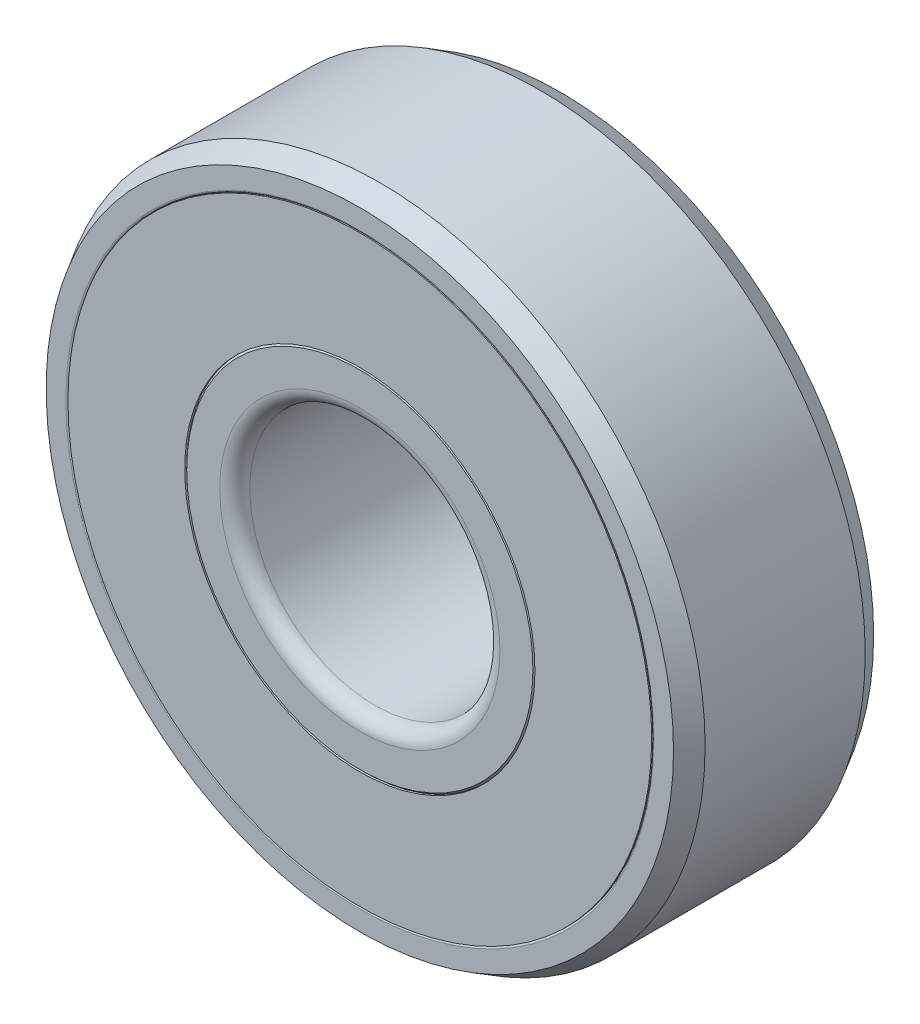
ISO-10303-21;
HEADER;
FILE_DESCRIPTION(('STEP AP214'),'2;1');
FILE_NAME('part.step','',(''),(''),'','','');
FILE_SCHEMA(('AUTOMOTIVE_DESIGN { 1 0 10303 214 1 1 1 1 }'));
ENDSEC;
DATA;
#1=APPLICATION_CONTEXT('core data for automotive mechanical design processes');
#2=APPLICATION_PROTOCOL_DEFINITION('international standard','automotive_design',2000,#1);
#3=PRODUCT_CONTEXT('',#1,'mechanical');
#4=PRODUCT('Part','Part','',(#3));
#5=PRODUCT_RELATED_PRODUCT_CATEGORY('part','',(#4));
#6=PRODUCT_DEFINITION_FORMATION('','',#4);
#7=PRODUCT_DEFINITION_CONTEXT('part definition',#1,'design');
#8=PRODUCT_DEFINITION('design','',#6,#7);
#9=PRODUCT_DEFINITION_SHAPE('','',#8);
#10=(LENGTH_UNIT() NAMED_UNIT(*) SI_UNIT(.MILLI.,.METRE.));
#11=(NAMED_UNIT(*) PLANE_ANGLE_UNIT() SI_UNIT($,.RADIAN.));
#12=(NAMED_UNIT(*) SI_UNIT($,.STERADIAN.) SOLID_ANGLE_UNIT());
#13=UNCERTAINTY_MEASURE_WITH_UNIT(LENGTH_MEASURE(1.E-05),#10,'distance_accuracy_value','');
#14=(GEOMETRIC_REPRESENTATION_CONTEXT(3) GLOBAL_UNCERTAINTY_ASSIGNED_CONTEXT((#13)) GLOBAL_UNIT_ASSIGNED_CONTEXT((#10,
#11,#12)) REPRESENTATION_CONTEXT('',''));
#15=CARTESIAN_POINT('',(0.,0.,0.));
#16=DIRECTION('',(0.,0.,1.));
#17=DIRECTION('',(1.,0.,0.));
#18=AXIS2_PLACEMENT_3D('',#15,#16,#17);
#19=CARTESIAN_POINT('',(3.6485469181841,-2.9096190753408,0.));
#20=DIRECTION('',(-0.781831482468022,0.623489801858743,0.));
#21=DIRECTION('',(0.,0.,-1.));
#22=AXIS2_PLACEMENT_3D('',#19,#20,#21);
#23=SPHERICAL_SURFACE('',#22,1.61111111111111);
#24=CARTESIAN_POINT('',(2.3889295297634,-1.90510772790171,0.));
#25=VERTEX_POINT('',#24);
#26=VERTEX_LOOP('',#25);
#27=FACE_BOUND('',#26,.T.);
#28=ADVANCED_FACE('F45',(#27),#23,.T.);
#29=CLOSED_SHELL('',(#28));
#30=MANIFOLD_SOLID_BREP('B2',#29);
#31=CARTESIAN_POINT('',(4.54966359018185,1.03843102512942,0.));
#32=DIRECTION('',(-0.974927912181826,-0.222520933956305,0.));
#33=DIRECTION('',(0.,0.,-1.));
#34=AXIS2_PLACEMENT_3D('',#31,#32,#33);
#35=SPHERICAL_SURFACE('',#34,1.61111111111111);
#36=CARTESIAN_POINT('',(2.97894639833336,0.679925075977598,0.));
#37=VERTEX_POINT('',#36);
#38=VERTEX_LOOP('',#37);
#39=FACE_BOUND('',#38,.T.);
#40=ADVANCED_FACE('F63',(#39),#35,.T.);
#41=CLOSED_SHELL('',(#40));
#42=MANIFOLD_SOLID_BREP('B6',#41);
#43=CARTESIAN_POINT('',(2.02479078254864,4.20452138354461,0.));
#44=DIRECTION('',(-0.433883739117565,-0.900968867902416,0.));
#45=DIRECTION('',(0.,0.,-1.));
#46=AXIS2_PLACEMENT_3D('',#43,#44,#45);
#47=SPHERICAL_SURFACE('',#46,1.61111111111111);
#48=CARTESIAN_POINT('',(1.32575586952589,2.75296042970182,0.));
#49=VERTEX_POINT('',#48);
#50=VERTEX_LOOP('',#49);
#51=FACE_BOUND('',#50,.T.);
#52=ADVANCED_FACE('F81',(#51),#47,.T.);
#53=CLOSED_SHELL('',(#52));
#54=MANIFOLD_SOLID_BREP('B41',#53);
#55=CARTESIAN_POINT('',(-2.02479078254858,4.20452138354463,0.));
#56=DIRECTION('',(0.433883739117553,-0.900968867902422,0.));
#57=DIRECTION('',(0.,0.,-1.));
#58=AXIS2_PLACEMENT_3D('',#55,#56,#57);
#59=SPHERICAL_SURFACE('',#58,1.61111111111111);
#60=CARTESIAN_POINT('',(-1.32575586952585,2.75296042970184,0.));
#61=VERTEX_POINT('',#60);
#62=VERTEX_LOOP('',#61);
#63=FACE_BOUND('',#62,.T.);
#64=ADVANCED_FACE('F99',(#63),#59,.T.);
#65=CLOSED_SHELL('',(#64));
#66=MANIFOLD_SOLID_BREP('B59',#65);
#67=CARTESIAN_POINT('',(-4.54966359018184,1.03843102512948,0.));
#68=DIRECTION('',(0.974927912181823,-0.222520933956318,0.));
#69=DIRECTION('',(0.,0.,-1.));
#70=AXIS2_PLACEMENT_3D('',#67,#68,#69);
#71=SPHERICAL_SURFACE('',#70,1.61111111111111);
#72=CARTESIAN_POINT('',(-2.97894639833335,0.679925075977639,0.));
#73=VERTEX_POINT('',#72);
#74=VERTEX_LOOP('',#73);
#75=FACE_BOUND('',#74,.T.);
#76=ADVANCED_FACE('F117',(#75),#71,.T.);
#77=CLOSED_SHELL('',(#76));
#78=MANIFOLD_SOLID_BREP('B77',#77);
#79=CARTESIAN_POINT('',(-3.64854691818414,-2.90961907534075,0.));
#80=DIRECTION('',(0.781831482468031,0.623489801858732,0.));
#81=DIRECTION('',(0.,0.,-1.));
#82=AXIS2_PLACEMENT_3D('',#79,#80,#81);
#83=SPHERICAL_SURFACE('',#82,1.61111111111111);
#84=CARTESIAN_POINT('',(-2.38892952976343,-1.90510772790168,0.));
#85=VERTEX_POINT('',#84);
#86=VERTEX_LOOP('',#85);
#87=FACE_BOUND('',#86,.T.);
#88=ADVANCED_FACE('F135',(#87),#83,.T.);
#89=CLOSED_SHELL('',(#88));
#90=MANIFOLD_SOLID_BREP('B95',#89);
#91=CARTESIAN_POINT('',(0.,-4.66666666666667,0.));
#92=DIRECTION('',(0.,1.,0.));
#93=DIRECTION('',(0.,0.,-1.));
#94=AXIS2_PLACEMENT_3D('',#91,#92,#93);
#95=SPHERICAL_SURFACE('',#94,1.61111111111111);
#96=CARTESIAN_POINT('',(0.,-3.05555555555555,0.));
#97=VERTEX_POINT('',#96);
#98=VERTEX_LOOP('',#97);
#99=FACE_BOUND('',#98,.T.);
#100=ADVANCED_FACE('F155',(#99),#95,.T.);
#101=CLOSED_SHELL('',(#100));
#102=MANIFOLD_SOLID_BREP('B113',#101);
#103=CARTESIAN_POINT('',(0.,-3.5,2.));
#104=DIRECTION('',(0.,0.,1.));
#105=DIRECTION('',(1.,0.,0.));
#106=AXIS2_PLACEMENT_3D('',#103,#104,#105);
#107=PLANE('',#106);
#108=CARTESIAN_POINT('',(0.,0.,2.));
#109=DIRECTION('',(0.,0.,1.));
#110=DIRECTION('',(1.,0.,0.));
#111=AXIS2_PLACEMENT_3D('',#108,#109,#110);
#112=CIRCLE('',#111,5.83333333333333);
#113=CARTESIAN_POINT('',(5.83333333333333,0.,2.));
#114=VERTEX_POINT('',#113);
#115=EDGE_CURVE('E154',#114,#114,#112,.T.);
#116=ORIENTED_EDGE('',*,*,#115,.T.);
#117=EDGE_LOOP('',(#116));
#118=FACE_BOUND('',#117,.T.);
#119=CARTESIAN_POINT('',(0.,0.,2.));
#120=DIRECTION('',(0.,0.,1.));
#121=DIRECTION('',(1.,0.,0.));
#122=AXIS2_PLACEMENT_3D('',#119,#120,#121);
#123=CIRCLE('',#122,3.5);
#124=CARTESIAN_POINT('',(3.5,0.,2.));
#125=VERTEX_POINT('',#124);
#126=EDGE_CURVE('E189',#125,#125,#123,.T.);
#127=ORIENTED_EDGE('',*,*,#126,.F.);
#128=EDGE_LOOP('',(#127));
#129=FACE_BOUND('',#128,.T.);
#130=ADVANCED_FACE('F175',(#118,#129),#107,.T.);
#131=CARTESIAN_POINT('',(0.,0.,2.));
#132=DIRECTION('',(0.,0.,1.));
#133=DIRECTION('',(1.,0.,0.));
#134=AXIS2_PLACEMENT_3D('',#131,#132,#133);
#135=CYLINDRICAL_SURFACE('',#134,5.83333333333333);
#136=CARTESIAN_POINT('',(0.,0.,1.70833333333333));
#137=DIRECTION('',(0.,0.,1.));
#138=DIRECTION('',(1.,0.,0.));
#139=AXIS2_PLACEMENT_3D('',#136,#137,#138);
#140=CIRCLE('',#139,5.83333333333333);
#141=CARTESIAN_POINT('',(5.83333333333333,0.,1.70833333333333));
#142=VERTEX_POINT('',#141);
#143=EDGE_CURVE('E181',#142,#142,#140,.T.);
#144=ORIENTED_EDGE('',*,*,#143,.T.);
#145=EDGE_LOOP('',(#144));
#146=FACE_BOUND('',#145,.T.);
#147=ORIENTED_EDGE('',*,*,#115,.F.);
#148=EDGE_LOOP('',(#147));
#149=FACE_BOUND('',#148,.T.);
#150=ADVANCED_FACE('F199',(#146,#149),#135,.T.);
#151=CARTESIAN_POINT('',(0.,-3.5,1.70833333333333));
#152=DIRECTION('',(0.,0.,-1.));
#153=DIRECTION('',(-1.,0.,0.));
#154=AXIS2_PLACEMENT_3D('',#151,#152,#153);
#155=PLANE('',#154);
#156=CARTESIAN_POINT('',(0.,0.,1.70833333333333));
#157=DIRECTION('',(0.,0.,1.));
#158=DIRECTION('',(1.,0.,0.));
#159=AXIS2_PLACEMENT_3D('',#156,#157,#158);
#160=CIRCLE('',#159,3.5);
#161=CARTESIAN_POINT('',(3.5,0.,1.70833333333333));
#162=VERTEX_POINT('',#161);
#163=EDGE_CURVE('E185',#162,#162,#160,.T.);
#164=ORIENTED_EDGE('',*,*,#163,.T.);
#165=EDGE_LOOP('',(#164));
#166=FACE_BOUND('',#165,.T.);
#167=ORIENTED_EDGE('',*,*,#143,.F.);
#168=EDGE_LOOP('',(#167));
#169=FACE_BOUND('',#168,.T.);
#170=ADVANCED_FACE('F203',(#166,#169),#155,.T.);
#171=CARTESIAN_POINT('',(0.,0.,2.));
#172=DIRECTION('',(0.,0.,1.));
#173=DIRECTION('',(1.,0.,0.));
#174=AXIS2_PLACEMENT_3D('',#171,#172,#173);
#175=CYLINDRICAL_SURFACE('',#174,3.5);
#176=ORIENTED_EDGE('',*,*,#126,.T.);
#177=EDGE_LOOP('',(#176));
#178=FACE_BOUND('',#177,.T.);
#179=ORIENTED_EDGE('',*,*,#163,.F.);
#180=EDGE_LOOP('',(#179));
#181=FACE_BOUND('',#180,.T.);
#182=ADVANCED_FACE('F195',(#178,#181),#175,.F.);
#183=CLOSED_SHELL('',(#130,#150,#170,#182));
#184=MANIFOLD_SOLID_BREP('B131',#183);
#185=CARTESIAN_POINT('',(0.,0.,1.7));
#186=DIRECTION('',(0.,0.,1.));
#187=DIRECTION('',(1.,0.,0.));
#188=AXIS2_PLACEMENT_3D('',#185,#186,#187);
#189=TOROIDAL_SURFACE('',#188,2.8,0.299999999999999);
#190=CARTESIAN_POINT('',(0.,0.,2.));
#191=DIRECTION('',(0.,0.,1.));
#192=DIRECTION('',(1.,0.,0.));
#193=AXIS2_PLACEMENT_3D('',#190,#191,#192);
#194=CIRCLE('',#193,2.8);
#195=CARTESIAN_POINT('',(2.8,0.,2.));
#196=VERTEX_POINT('',#195);
#197=EDGE_CURVE('E174',#196,#196,#194,.T.);
#198=ORIENTED_EDGE('',*,*,#197,.T.);
#199=EDGE_LOOP('',(#198));
#200=FACE_BOUND('',#199,.T.);
#201=CARTESIAN_POINT('',(0.,0.,1.7));
#202=DIRECTION('',(0.,0.,1.));
#203=DIRECTION('',(1.,0.,0.));
#204=AXIS2_PLACEMENT_3D('',#201,#202,#203);
#205=CIRCLE('',#204,2.5);
#206=CARTESIAN_POINT('',(2.5,0.,1.7));
#207=VERTEX_POINT('',#206);
#208=EDGE_CURVE('E277',#207,#207,#205,.T.);
#209=ORIENTED_EDGE('',*,*,#208,.F.);
#210=EDGE_LOOP('',(#209));
#211=FACE_BOUND('',#210,.T.);
#212=ADVANCED_FACE('F243',(#200,#211),#189,.T.);
#213=CARTESIAN_POINT('',(0.,-3.46,2.));
#214=DIRECTION('',(0.,0.,1.));
#215=DIRECTION('',(1.,0.,0.));
#216=AXIS2_PLACEMENT_3D('',#213,#214,#215);
#217=PLANE('',#216);
#218=CARTESIAN_POINT('',(0.,0.,2.));
#219=DIRECTION('',(0.,0.,1.));
#220=DIRECTION('',(1.,0.,0.));
#221=AXIS2_PLACEMENT_3D('',#218,#219,#220);
#222=CIRCLE('',#221,3.46);
#223=CARTESIAN_POINT('',(3.46,0.,2.));
#224=VERTEX_POINT('',#223);
#225=EDGE_CURVE('E249',#224,#224,#222,.T.);
#226=ORIENTED_EDGE('',*,*,#225,.T.);
#227=EDGE_LOOP('',(#226));
#228=FACE_BOUND('',#227,.T.);
#229=ORIENTED_EDGE('',*,*,#197,.F.);
#230=EDGE_LOOP('',(#229));
#231=FACE_BOUND('',#230,.T.);
#232=ADVANCED_FACE('F285',(#228,#231),#217,.T.);
#233=CARTESIAN_POINT('',(0.,0.,2.));
#234=DIRECTION('',(0.,0.,-1.));
#235=DIRECTION('',(-1.,0.,0.));
#236=AXIS2_PLACEMENT_3D('',#233,#234,#235);
#237=CONICAL_SURFACE('',#236,3.46,0.785398163397448);
#238=CARTESIAN_POINT('',(0.,0.,1.96));
#239=DIRECTION('',(0.,0.,1.));
#240=DIRECTION('',(1.,0.,0.));
#241=AXIS2_PLACEMENT_3D('',#238,#239,#240);
#242=CIRCLE('',#241,3.5);
#243=CARTESIAN_POINT('',(3.5,0.,1.96));
#244=VERTEX_POINT('',#243);
#245=EDGE_CURVE('E253',#244,#244,#242,.T.);
#246=ORIENTED_EDGE('',*,*,#245,.T.);
#247=EDGE_LOOP('',(#246));
#248=FACE_BOUND('',#247,.T.);
#249=ORIENTED_EDGE('',*,*,#225,.F.);
#250=EDGE_LOOP('',(#249));
#251=FACE_BOUND('',#250,.T.);
#252=ADVANCED_FACE('F289',(#248,#251),#237,.T.);
#253=CARTESIAN_POINT('',(0.,0.,2.));
#254=DIRECTION('',(0.,0.,1.));
#255=DIRECTION('',(1.,0.,0.));
#256=AXIS2_PLACEMENT_3D('',#253,#254,#255);
#257=CYLINDRICAL_SURFACE('',#256,3.5);
#258=CARTESIAN_POINT('',(0.,0.,1.11111111111111));
#259=DIRECTION('',(0.,0.,1.));
#260=DIRECTION('',(1.,0.,0.));
#261=AXIS2_PLACEMENT_3D('',#258,#259,#260);
#262=CIRCLE('',#261,3.5);
#263=CARTESIAN_POINT('',(3.5,0.,1.11111111111111));
#264=VERTEX_POINT('',#263);
#265=EDGE_CURVE('E257',#264,#264,#262,.T.);
#266=ORIENTED_EDGE('',*,*,#265,.T.);
#267=EDGE_LOOP('',(#266));
#268=FACE_BOUND('',#267,.T.);
#269=ORIENTED_EDGE('',*,*,#245,.F.);
#270=EDGE_LOOP('',(#269));
#271=FACE_BOUND('',#270,.T.);
#272=ADVANCED_FACE('F293',(#268,#271),#257,.T.);
#273=CARTESIAN_POINT('',(0.,0.,0.));
#274=DIRECTION('',(0.,0.,1.));
#275=DIRECTION('',(1.,0.,0.));
#276=AXIS2_PLACEMENT_3D('',#273,#274,#275);
#277=TOROIDAL_SURFACE('',#276,4.66666666666667,1.61111111111111);
#278=CARTESIAN_POINT('',(0.,0.,-1.11111111111111));
#279=DIRECTION('',(0.,0.,1.));
#280=DIRECTION('',(1.,0.,0.));
#281=AXIS2_PLACEMENT_3D('',#278,#279,#280);
#282=CIRCLE('',#281,3.5);
#283=CARTESIAN_POINT('',(3.5,0.,-1.11111111111111));
#284=VERTEX_POINT('',#283);
#285=EDGE_CURVE('E262',#284,#284,#282,.T.);
#286=ORIENTED_EDGE('',*,*,#285,.T.);
#287=EDGE_LOOP('',(#286));
#288=FACE_BOUND('',#287,.T.);
#289=ORIENTED_EDGE('',*,*,#265,.F.);
#290=EDGE_LOOP('',(#289));
#291=FACE_BOUND('',#290,.T.);
#292=ADVANCED_FACE('F300',(#288,#291),#277,.F.);
#293=CARTESIAN_POINT('',(0.,0.,2.));
#294=DIRECTION('',(0.,0.,1.));
#295=DIRECTION('',(1.,0.,0.));
#296=AXIS2_PLACEMENT_3D('',#293,#294,#295);
#297=CYLINDRICAL_SURFACE('',#296,3.5);
#298=CARTESIAN_POINT('',(0.,0.,-1.96));
#299=DIRECTION('',(0.,0.,1.));
#300=DIRECTION('',(1.,0.,0.));
#301=AXIS2_PLACEMENT_3D('',#298,#299,#300);
#302=CIRCLE('',#301,3.5);
#303=CARTESIAN_POINT('',(3.5,0.,-1.96));
#304=VERTEX_POINT('',#303);
#305=EDGE_CURVE('E265',#304,#304,#302,.T.);
#306=ORIENTED_EDGE('',*,*,#305,.T.);
#307=EDGE_LOOP('',(#306));
#308=FACE_BOUND('',#307,.T.);
#309=ORIENTED_EDGE('',*,*,#285,.F.);
#310=EDGE_LOOP('',(#309));
#311=FACE_BOUND('',#310,.T.);
#312=ADVANCED_FACE('F304',(#308,#311),#297,.T.);
#313=CARTESIAN_POINT('',(0.,0.,-1.96));
#314=DIRECTION('',(0.,0.,1.));
#315=DIRECTION('',(1.,0.,0.));
#316=AXIS2_PLACEMENT_3D('',#313,#314,#315);
#317=CONICAL_SURFACE('',#316,3.5,0.785398163397448);
#318=CARTESIAN_POINT('',(0.,0.,-2.));
#319=DIRECTION('',(0.,0.,1.));
#320=DIRECTION('',(1.,0.,0.));
#321=AXIS2_PLACEMENT_3D('',#318,#319,#320);
#322=CIRCLE('',#321,3.46);
#323=CARTESIAN_POINT('',(3.46,0.,-2.));
#324=VERTEX_POINT('',#323);
#325=EDGE_CURVE('E268',#324,#324,#322,.T.);
#326=ORIENTED_EDGE('',*,*,#325,.T.);
#327=EDGE_LOOP('',(#326));
#328=FACE_BOUND('',#327,.T.);
#329=ORIENTED_EDGE('',*,*,#305,.F.);
#330=EDGE_LOOP('',(#329));
#331=FACE_BOUND('',#330,.T.);
#332=ADVANCED_FACE('F308',(#328,#331),#317,.T.);
#333=CARTESIAN_POINT('',(0.,-3.46,-2.));
#334=DIRECTION('',(0.,0.,-1.));
#335=DIRECTION('',(-1.,0.,0.));
#336=AXIS2_PLACEMENT_3D('',#333,#334,#335);
#337=PLANE('',#336);
#338=CARTESIAN_POINT('',(0.,0.,-2.));
#339=DIRECTION('',(0.,0.,1.));
#340=DIRECTION('',(1.,0.,0.));
#341=AXIS2_PLACEMENT_3D('',#338,#339,#340);
#342=CIRCLE('',#341,2.8);
#343=CARTESIAN_POINT('',(2.8,0.,-2.));
#344=VERTEX_POINT('',#343);
#345=EDGE_CURVE('E271',#344,#344,#342,.T.);
#346=ORIENTED_EDGE('',*,*,#345,.T.);
#347=EDGE_LOOP('',(#346));
#348=FACE_BOUND('',#347,.T.);
#349=ORIENTED_EDGE('',*,*,#325,.F.);
#350=EDGE_LOOP('',(#349));
#351=FACE_BOUND('',#350,.T.);
#352=ADVANCED_FACE('F312',(#348,#351),#337,.T.);
#353=CARTESIAN_POINT('',(0.,0.,-1.7));
#354=DIRECTION('',(0.,0.,1.));
#355=DIRECTION('',(1.,0.,0.));
#356=AXIS2_PLACEMENT_3D('',#353,#354,#355);
#357=TOROIDAL_SURFACE('',#356,2.8,0.299999999999999);
#358=CARTESIAN_POINT('',(0.,0.,-1.7));
#359=DIRECTION('',(0.,0.,1.));
#360=DIRECTION('',(1.,0.,0.));
#361=AXIS2_PLACEMENT_3D('',#358,#359,#360);
#362=CIRCLE('',#361,2.5);
#363=CARTESIAN_POINT('',(2.5,0.,-1.7));
#364=VERTEX_POINT('',#363);
#365=EDGE_CURVE('E274',#364,#364,#362,.T.);
#366=ORIENTED_EDGE('',*,*,#365,.T.);
#367=EDGE_LOOP('',(#366));
#368=FACE_BOUND('',#367,.T.);
#369=ORIENTED_EDGE('',*,*,#345,.F.);
#370=EDGE_LOOP('',(#369));
#371=FACE_BOUND('',#370,.T.);
#372=ADVANCED_FACE('F316',(#368,#371),#357,.T.);
#373=CARTESIAN_POINT('',(0.,0.,2.));
#374=DIRECTION('',(0.,0.,1.));
#375=DIRECTION('',(1.,0.,0.));
#376=AXIS2_PLACEMENT_3D('',#373,#374,#375);
#377=CYLINDRICAL_SURFACE('',#376,2.5);
#378=ORIENTED_EDGE('',*,*,#208,.T.);
#379=EDGE_LOOP('',(#378));
#380=FACE_BOUND('',#379,.T.);
#381=ORIENTED_EDGE('',*,*,#365,.F.);
#382=EDGE_LOOP('',(#381));
#383=FACE_BOUND('',#382,.T.);
#384=ADVANCED_FACE('F281',(#380,#383),#377,.F.);
#385=CLOSED_SHELL('',(#212,#232,#252,#272,#292,#312,#332,#352,#372,#384));
#386=MANIFOLD_SOLID_BREP('B149',#385);
#387=CARTESIAN_POINT('',(0.,0.,2.));
#388=DIRECTION('',(0.,0.,-1.));
#389=DIRECTION('',(-1.,0.,0.));
#390=AXIS2_PLACEMENT_3D('',#387,#388,#389);
#391=CONICAL_SURFACE('',#390,6.26905989232416,0.52359877559828);
#392=CARTESIAN_POINT('',(0.,0.,1.6));
#393=DIRECTION('',(0.,0.,1.));
#394=DIRECTION('',(1.,0.,0.));
#395=AXIS2_PLACEMENT_3D('',#392,#393,#394);
#396=CIRCLE('',#395,6.5);
#397=CARTESIAN_POINT('',(6.5,0.,1.6));
#398=VERTEX_POINT('',#397);
#399=EDGE_CURVE('E242',#398,#398,#396,.T.);
#400=ORIENTED_EDGE('',*,*,#399,.T.);
#401=EDGE_LOOP('',(#400));
#402=FACE_BOUND('',#401,.T.);
#403=CARTESIAN_POINT('',(0.,0.,2.));
#404=DIRECTION('',(0.,0.,1.));
#405=DIRECTION('',(1.,0.,0.));
#406=AXIS2_PLACEMENT_3D('',#403,#404,#405);
#407=CIRCLE('',#406,6.26905989232416);
#408=CARTESIAN_POINT('',(6.26905989232416,0.,2.));
#409=VERTEX_POINT('',#408);
#410=EDGE_CURVE('E438',#409,#409,#407,.T.);
#411=ORIENTED_EDGE('',*,*,#410,.F.);
#412=EDGE_LOOP('',(#411));
#413=FACE_BOUND('',#412,.T.);
#414=ADVANCED_FACE('F395',(#402,#413),#391,.T.);
#415=CARTESIAN_POINT('',(0.,0.,2.));
#416=DIRECTION('',(0.,0.,1.));
#417=DIRECTION('',(1.,0.,0.));
#418=AXIS2_PLACEMENT_3D('',#415,#416,#417);
#419=CYLINDRICAL_SURFACE('',#418,6.5);
#420=CARTESIAN_POINT('',(0.,0.,-1.6));
#421=DIRECTION('',(0.,0.,1.));
#422=DIRECTION('',(1.,0.,0.));
#423=AXIS2_PLACEMENT_3D('',#420,#421,#422);
#424=CIRCLE('',#423,6.5);
#425=CARTESIAN_POINT('',(6.5,0.,-1.6));
#426=VERTEX_POINT('',#425);
#427=EDGE_CURVE('E402',#426,#426,#424,.T.);
#428=ORIENTED_EDGE('',*,*,#427,.T.);
#429=EDGE_LOOP('',(#428));
#430=FACE_BOUND('',#429,.T.);
#431=ORIENTED_EDGE('',*,*,#399,.F.);
#432=EDGE_LOOP('',(#431));
#433=FACE_BOUND('',#432,.T.);
#434=ADVANCED_FACE('F447',(#430,#433),#419,.T.);
#435=CARTESIAN_POINT('',(0.,0.,-1.6));
#436=DIRECTION('',(0.,0.,1.));
#437=DIRECTION('',(1.,0.,0.));
#438=AXIS2_PLACEMENT_3D('',#435,#436,#437);
#439=CONICAL_SURFACE('',#438,6.5,0.52359877559828);
#440=CARTESIAN_POINT('',(0.,0.,-2.));
#441=DIRECTION('',(0.,0.,1.));
#442=DIRECTION('',(1.,0.,0.));
#443=AXIS2_PLACEMENT_3D('',#440,#441,#442);
#444=CIRCLE('',#443,6.26905989232416);
#445=CARTESIAN_POINT('',(6.26905989232416,0.,-2.));
#446=VERTEX_POINT('',#445);
#447=EDGE_CURVE('E407',#446,#446,#444,.T.);
#448=ORIENTED_EDGE('',*,*,#447,.T.);
#449=EDGE_LOOP('',(#448));
#450=FACE_BOUND('',#449,.T.);
#451=ORIENTED_EDGE('',*,*,#427,.F.);
#452=EDGE_LOOP('',(#451));
#453=FACE_BOUND('',#452,.T.);
#454=ADVANCED_FACE('F451',(#450,#453),#439,.T.);
#455=CARTESIAN_POINT('',(0.,-5.87333333333333,-2.));
#456=DIRECTION('',(0.,0.,-1.));
#457=DIRECTION('',(-1.,0.,0.));
#458=AXIS2_PLACEMENT_3D('',#455,#456,#457);
#459=PLANE('',#458);
#460=CARTESIAN_POINT('',(0.,0.,-2.));
#461=DIRECTION('',(0.,0.,1.));
#462=DIRECTION('',(1.,0.,0.));
#463=AXIS2_PLACEMENT_3D('',#460,#461,#462);
#464=CIRCLE('',#463,5.87333333333333);
#465=CARTESIAN_POINT('',(5.87333333333333,0.,-2.));
#466=VERTEX_POINT('',#465);
#467=EDGE_CURVE('E412',#466,#466,#464,.T.);
#468=ORIENTED_EDGE('',*,*,#467,.T.);
#469=EDGE_LOOP('',(#468));
#470=FACE_BOUND('',#469,.T.);
#471=ORIENTED_EDGE('',*,*,#447,.F.);
#472=EDGE_LOOP('',(#471));
#473=FACE_BOUND('',#472,.T.);
#474=ADVANCED_FACE('F455',(#470,#473),#459,.T.);
#475=CARTESIAN_POINT('',(0.,0.,-1.96));
#476=DIRECTION('',(0.,0.,1.));
#477=DIRECTION('',(1.,0.,0.));
#478=AXIS2_PLACEMENT_3D('',#475,#476,#477);
#479=TOROIDAL_SURFACE('',#478,5.87333333333333,0.0399999999999997);
#480=CARTESIAN_POINT('',(0.,0.,-1.96));
#481=DIRECTION('',(0.,0.,1.));
#482=DIRECTION('',(1.,0.,0.));
#483=AXIS2_PLACEMENT_3D('',#480,#481,#482);
#484=CIRCLE('',#483,5.83333333333333);
#485=CARTESIAN_POINT('',(5.83333333333333,0.,-1.96));
#486=VERTEX_POINT('',#485);
#487=EDGE_CURVE('E418',#486,#486,#484,.T.);
#488=ORIENTED_EDGE('',*,*,#487,.T.);
#489=EDGE_LOOP('',(#488));
#490=FACE_BOUND('',#489,.T.);
#491=ORIENTED_EDGE('',*,*,#467,.F.);
#492=EDGE_LOOP('',(#491));
#493=FACE_BOUND('',#492,.T.);
#494=ADVANCED_FACE('F462',(#490,#493),#479,.T.);
#495=CARTESIAN_POINT('',(0.,0.,2.));
#496=DIRECTION('',(0.,0.,1.));
#497=DIRECTION('',(1.,0.,0.));
#498=AXIS2_PLACEMENT_3D('',#495,#496,#497);
#499=CYLINDRICAL_SURFACE('',#498,5.83333333333333);
#500=CARTESIAN_POINT('',(0.,0.,-1.11111111111111));
#501=DIRECTION('',(0.,0.,1.));
#502=DIRECTION('',(1.,0.,0.));
#503=AXIS2_PLACEMENT_3D('',#500,#501,#502);
#504=CIRCLE('',#503,5.83333333333333);
#505=CARTESIAN_POINT('',(5.83333333333333,0.,-1.11111111111111));
#506=VERTEX_POINT('',#505);
#507=EDGE_CURVE('E422',#506,#506,#504,.T.);
#508=ORIENTED_EDGE('',*,*,#507,.T.);
#509=EDGE_LOOP('',(#508));
#510=FACE_BOUND('',#509,.T.);
#511=ORIENTED_EDGE('',*,*,#487,.F.);
#512=EDGE_LOOP('',(#511));
#513=FACE_BOUND('',#512,.T.);
#514=ADVANCED_FACE('F466',(#510,#513),#499,.F.);
#515=CARTESIAN_POINT('',(0.,0.,0.));
#516=DIRECTION('',(0.,0.,1.));
#517=DIRECTION('',(1.,0.,0.));
#518=AXIS2_PLACEMENT_3D('',#515,#516,#517);
#519=TOROIDAL_SURFACE('',#518,4.66666666666667,1.61111111111111);
#520=CARTESIAN_POINT('',(0.,0.,1.11111111111111));
#521=DIRECTION('',(0.,0.,1.));
#522=DIRECTION('',(1.,0.,0.));
#523=AXIS2_PLACEMENT_3D('',#520,#521,#522);
#524=CIRCLE('',#523,5.83333333333333);
#525=CARTESIAN_POINT('',(5.83333333333333,0.,1.11111111111111));
#526=VERTEX_POINT('',#525);
#527=EDGE_CURVE('E426',#526,#526,#524,.T.);
#528=ORIENTED_EDGE('',*,*,#527,.T.);
#529=EDGE_LOOP('',(#528));
#530=FACE_BOUND('',#529,.T.);
#531=ORIENTED_EDGE('',*,*,#507,.F.);
#532=EDGE_LOOP('',(#531));
#533=FACE_BOUND('',#532,.T.);
#534=ADVANCED_FACE('F470',(#530,#533),#519,.F.);
#535=CARTESIAN_POINT('',(0.,0.,2.));
#536=DIRECTION('',(0.,0.,1.));
#537=DIRECTION('',(1.,0.,0.));
#538=AXIS2_PLACEMENT_3D('',#535,#536,#537);
#539=CYLINDRICAL_SURFACE('',#538,5.83333333333333);
#540=CARTESIAN_POINT('',(0.,0.,1.96));
#541=DIRECTION('',(0.,0.,1.));
#542=DIRECTION('',(1.,0.,0.));
#543=AXIS2_PLACEMENT_3D('',#540,#541,#542);
#544=CIRCLE('',#543,5.83333333333333);
#545=CARTESIAN_POINT('',(5.83333333333333,0.,1.96));
#546=VERTEX_POINT('',#545);
#547=EDGE_CURVE('E430',#546,#546,#544,.T.);
#548=ORIENTED_EDGE('',*,*,#547,.T.);
#549=EDGE_LOOP('',(#548));
#550=FACE_BOUND('',#549,.T.);
#551=ORIENTED_EDGE('',*,*,#527,.F.);
#552=EDGE_LOOP('',(#551));
#553=FACE_BOUND('',#552,.T.);
#554=ADVANCED_FACE('F474',(#550,#553),#539,.F.);
#555=CARTESIAN_POINT('',(0.,0.,1.96));
#556=DIRECTION('',(0.,0.,1.));
#557=DIRECTION('',(1.,0.,0.));
#558=AXIS2_PLACEMENT_3D('',#555,#556,#557);
#559=TOROIDAL_SURFACE('',#558,5.87333333333333,0.0399999999999997);
#560=CARTESIAN_POINT('',(0.,0.,2.));
#561=DIRECTION('',(0.,0.,1.));
#562=DIRECTION('',(1.,0.,0.));
#563=AXIS2_PLACEMENT_3D('',#560,#561,#562);
#564=CIRCLE('',#563,5.87333333333333);
#565=CARTESIAN_POINT('',(5.87333333333333,0.,2.));
#566=VERTEX_POINT('',#565);
#567=EDGE_CURVE('E434',#566,#566,#564,.T.);
#568=ORIENTED_EDGE('',*,*,#567,.T.);
#569=EDGE_LOOP('',(#568));
#570=FACE_BOUND('',#569,.T.);
#571=ORIENTED_EDGE('',*,*,#547,.F.);
#572=EDGE_LOOP('',(#571));
#573=FACE_BOUND('',#572,.T.);
#574=ADVANCED_FACE('F478',(#570,#573),#559,.T.);
#575=CARTESIAN_POINT('',(0.,-5.87333333333333,2.));
#576=DIRECTION('',(0.,0.,1.));
#577=DIRECTION('',(1.,0.,0.));
#578=AXIS2_PLACEMENT_3D('',#575,#576,#577);
#579=PLANE('',#578);
#580=ORIENTED_EDGE('',*,*,#410,.T.);
#581=EDGE_LOOP('',(#580));
#582=FACE_BOUND('',#581,.T.);
#583=ORIENTED_EDGE('',*,*,#567,.F.);
#584=EDGE_LOOP('',(#583));
#585=FACE_BOUND('',#584,.T.);
#586=ADVANCED_FACE('F443',(#582,#585),#579,.T.);
#587=CLOSED_SHELL('',(#414,#434,#454,#474,#494,#514,#534,#554,#574,#586));
#588=MANIFOLD_SOLID_BREP('B169',#587);
#589=ADVANCED_BREP_SHAPE_REPRESENTATION('',(#18,#30,#42,#54,#66,#78,#90,#102,#184,#386,#588),#14);
#590=SHAPE_DEFINITION_REPRESENTATION(#9,#589);
ENDSEC;
END-ISO-10303-21;
